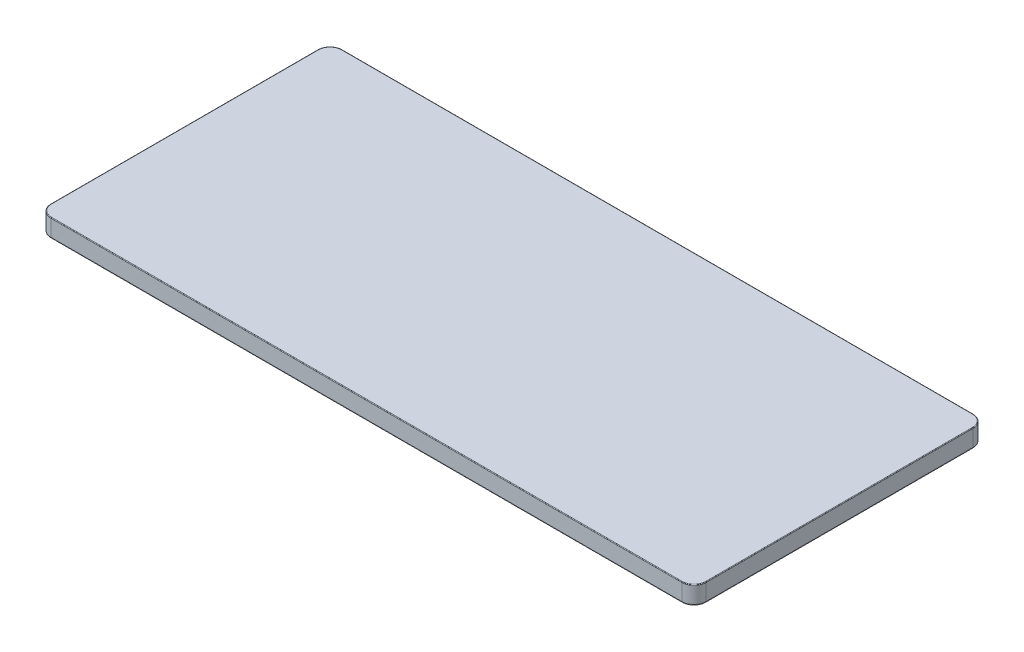
ISO-10303-21;
HEADER;
FILE_DESCRIPTION(('STEP AP214'),'2;1');
FILE_NAME('part.step','',(''),(''),'','','');
FILE_SCHEMA(('AUTOMOTIVE_DESIGN { 1 0 10303 214 1 1 1 1 }'));
ENDSEC;
DATA;
#1=APPLICATION_CONTEXT('core data for automotive mechanical design processes');
#2=APPLICATION_PROTOCOL_DEFINITION('international standard','automotive_design',2000,#1);
#3=PRODUCT_CONTEXT('',#1,'mechanical');
#4=PRODUCT('Part','Part','',(#3));
#5=PRODUCT_RELATED_PRODUCT_CATEGORY('part','',(#4));
#6=PRODUCT_DEFINITION_FORMATION('','',#4);
#7=PRODUCT_DEFINITION_CONTEXT('part definition',#1,'design');
#8=PRODUCT_DEFINITION('design','',#6,#7);
#9=PRODUCT_DEFINITION_SHAPE('','',#8);
#10=(LENGTH_UNIT() NAMED_UNIT(*) SI_UNIT(.MILLI.,.METRE.));
#11=(NAMED_UNIT(*) PLANE_ANGLE_UNIT() SI_UNIT($,.RADIAN.));
#12=(NAMED_UNIT(*) SI_UNIT($,.STERADIAN.) SOLID_ANGLE_UNIT());
#13=UNCERTAINTY_MEASURE_WITH_UNIT(LENGTH_MEASURE(1.E-05),#10,'distance_accuracy_value','');
#14=(GEOMETRIC_REPRESENTATION_CONTEXT(3) GLOBAL_UNCERTAINTY_ASSIGNED_CONTEXT((#13)) GLOBAL_UNIT_ASSIGNED_CONTEXT((#10,
#11,#12)) REPRESENTATION_CONTEXT('',''));
#15=CARTESIAN_POINT('',(0.,0.,0.));
#16=DIRECTION('',(0.,0.,1.));
#17=DIRECTION('',(1.,0.,0.));
#18=AXIS2_PLACEMENT_3D('',#15,#16,#17);
#19=CARTESIAN_POINT('',(660.4,-38.1,279.4));
#20=DIRECTION('',(0.,1.,0.));
#21=DIRECTION('',(0.,0.,1.));
#22=AXIS2_PLACEMENT_3D('',#19,#20,#21);
#23=PLANE('',#22);
#24=CARTESIAN_POINT('',(-342.9,-38.1,127.));
#25=DIRECTION('',(0.,-1.,0.));
#26=DIRECTION('',(0.,0.,-1.));
#27=AXIS2_PLACEMENT_3D('',#24,#25,#26);
#28=CIRCLE('',#27,1.58750000000004);
#29=CARTESIAN_POINT('',(-342.9,-38.1,125.4125));
#30=VERTEX_POINT('',#29);
#31=EDGE_CURVE('E322',#30,#30,#28,.T.);
#32=ORIENTED_EDGE('',*,*,#31,.F.);
#33=EDGE_LOOP('',(#32));
#34=FACE_BOUND('',#33,.T.);
#35=CARTESIAN_POINT('',(457.2,-38.1,-127.));
#36=DIRECTION('',(0.,-1.,0.));
#37=DIRECTION('',(0.,0.,-1.));
#38=AXIS2_PLACEMENT_3D('',#35,#36,#37);
#39=CIRCLE('',#38,1.58750000000004);
#40=CARTESIAN_POINT('',(457.2,-38.1,-128.5875));
#41=VERTEX_POINT('',#40);
#42=EDGE_CURVE('E353',#41,#41,#39,.T.);
#43=ORIENTED_EDGE('',*,*,#42,.F.);
#44=EDGE_LOOP('',(#43));
#45=FACE_BOUND('',#44,.T.);
#46=CARTESIAN_POINT('',(342.9,-38.1,-127.));
#47=DIRECTION('',(0.,-1.,0.));
#48=DIRECTION('',(0.,0.,-1.));
#49=AXIS2_PLACEMENT_3D('',#46,#47,#48);
#50=CIRCLE('',#49,1.58750000000004);
#51=CARTESIAN_POINT('',(342.9,-38.1,-128.5875));
#52=VERTEX_POINT('',#51);
#53=EDGE_CURVE('E352',#52,#52,#50,.T.);
#54=ORIENTED_EDGE('',*,*,#53,.F.);
#55=EDGE_LOOP('',(#54));
#56=FACE_BOUND('',#55,.T.);
#57=CARTESIAN_POINT('',(-457.2,-38.1,127.));
#58=DIRECTION('',(0.,-1.,0.));
#59=DIRECTION('',(0.,0.,-1.));
#60=AXIS2_PLACEMENT_3D('',#57,#58,#59);
#61=CIRCLE('',#60,1.58750000000004);
#62=CARTESIAN_POINT('',(-457.2,-38.1,125.4125));
#63=VERTEX_POINT('',#62);
#64=EDGE_CURVE('E319',#63,#63,#61,.T.);
#65=ORIENTED_EDGE('',*,*,#64,.F.);
#66=EDGE_LOOP('',(#65));
#67=FACE_BOUND('',#66,.T.);
#68=DIRECTION('',(1.,0.,0.));
#69=VECTOR('',#68,1.);
#70=CARTESIAN_POINT('',(-660.4,-38.1,302.26));
#71=LINE('',#70,#69);
#72=CARTESIAN_POINT('',(660.4,-38.1,302.26));
#73=VERTEX_POINT('',#72);
#74=CARTESIAN_POINT('',(-660.4,-38.1,302.26));
#75=VERTEX_POINT('',#74);
#76=EDGE_CURVE('E194',#73,#75,#71,.F.);
#77=ORIENTED_EDGE('',*,*,#76,.T.);
#78=CARTESIAN_POINT('',(-660.4,-38.1,279.4));
#79=DIRECTION('',(0.,1.,0.));
#80=DIRECTION('',(0.,0.,1.));
#81=AXIS2_PLACEMENT_3D('',#78,#79,#80);
#82=CIRCLE('',#81,22.86);
#83=CARTESIAN_POINT('',(-683.26,-38.1,279.4));
#84=VERTEX_POINT('',#83);
#85=EDGE_CURVE('E167',#75,#84,#82,.F.);
#86=ORIENTED_EDGE('',*,*,#85,.T.);
#87=DIRECTION('',(0.,0.,1.));
#88=VECTOR('',#87,1.);
#89=CARTESIAN_POINT('',(-683.26,-38.1,-279.4));
#90=LINE('',#89,#88);
#91=CARTESIAN_POINT('',(-683.26,-38.1,-279.4));
#92=VERTEX_POINT('',#91);
#93=EDGE_CURVE('E184',#84,#92,#90,.F.);
#94=ORIENTED_EDGE('',*,*,#93,.T.);
#95=CARTESIAN_POINT('',(-660.4,-38.1,-279.4));
#96=DIRECTION('',(0.,1.,0.));
#97=DIRECTION('',(0.,0.,1.));
#98=AXIS2_PLACEMENT_3D('',#95,#96,#97);
#99=CIRCLE('',#98,22.86);
#100=CARTESIAN_POINT('',(-660.4,-38.1,-302.26));
#101=VERTEX_POINT('',#100);
#102=EDGE_CURVE('E211',#92,#101,#99,.F.);
#103=ORIENTED_EDGE('',*,*,#102,.T.);
#104=DIRECTION('',(-1.,0.,0.));
#105=VECTOR('',#104,1.);
#106=CARTESIAN_POINT('',(660.4,-38.1,-302.26));
#107=LINE('',#106,#105);
#108=CARTESIAN_POINT('',(660.4,-38.1,-302.26));
#109=VERTEX_POINT('',#108);
#110=EDGE_CURVE('E209',#101,#109,#107,.F.);
#111=ORIENTED_EDGE('',*,*,#110,.T.);
#112=CARTESIAN_POINT('',(660.4,-38.1,-279.4));
#113=DIRECTION('',(0.,1.,0.));
#114=DIRECTION('',(0.,0.,1.));
#115=AXIS2_PLACEMENT_3D('',#112,#113,#114);
#116=CIRCLE('',#115,22.8599999999999);
#117=CARTESIAN_POINT('',(683.26,-38.1,-279.4));
#118=VERTEX_POINT('',#117);
#119=EDGE_CURVE('E207',#109,#118,#116,.F.);
#120=ORIENTED_EDGE('',*,*,#119,.T.);
#121=DIRECTION('',(0.,0.,-1.));
#122=VECTOR('',#121,1.);
#123=CARTESIAN_POINT('',(683.26,-38.1,279.4));
#124=LINE('',#123,#122);
#125=CARTESIAN_POINT('',(683.26,-38.1,279.4));
#126=VERTEX_POINT('',#125);
#127=EDGE_CURVE('E205',#118,#126,#124,.F.);
#128=ORIENTED_EDGE('',*,*,#127,.T.);
#129=CARTESIAN_POINT('',(660.4,-38.1,279.4));
#130=DIRECTION('',(0.,1.,0.));
#131=DIRECTION('',(0.,0.,1.));
#132=AXIS2_PLACEMENT_3D('',#129,#130,#131);
#133=CIRCLE('',#132,22.8599999999999);
#134=EDGE_CURVE('E197',#126,#73,#133,.F.);
#135=ORIENTED_EDGE('',*,*,#134,.T.);
#136=EDGE_LOOP('',(#77,#86,#94,#103,#111,#120,#128,#135));
#137=FACE_BOUND('',#136,.T.);
#138=CARTESIAN_POINT('',(457.2,-38.1,127.));
#139=DIRECTION('',(0.,1.,0.));
#140=DIRECTION('',(0.,0.,1.));
#141=AXIS2_PLACEMENT_3D('',#138,#139,#140);
#142=CIRCLE('',#141,1.58750000000004);
#143=CARTESIAN_POINT('',(457.2,-38.1,128.5875));
#144=VERTEX_POINT('',#143);
#145=EDGE_CURVE('E341',#144,#144,#142,.T.);
#146=ORIENTED_EDGE('',*,*,#145,.T.);
#147=EDGE_LOOP('',(#146));
#148=FACE_BOUND('',#147,.T.);
#149=CARTESIAN_POINT('',(-457.2,-38.1,-127.));
#150=DIRECTION('',(0.,1.,0.));
#151=DIRECTION('',(0.,0.,1.));
#152=AXIS2_PLACEMENT_3D('',#149,#150,#151);
#153=CIRCLE('',#152,1.58750000000004);
#154=CARTESIAN_POINT('',(-457.2,-38.1,-125.4125));
#155=VERTEX_POINT('',#154);
#156=EDGE_CURVE('E328',#155,#155,#153,.T.);
#157=ORIENTED_EDGE('',*,*,#156,.T.);
#158=EDGE_LOOP('',(#157));
#159=FACE_BOUND('',#158,.T.);
#160=CARTESIAN_POINT('',(-342.9,-38.1,-127.));
#161=DIRECTION('',(0.,1.,0.));
#162=DIRECTION('',(0.,0.,1.));
#163=AXIS2_PLACEMENT_3D('',#160,#161,#162);
#164=CIRCLE('',#163,1.58750000000004);
#165=CARTESIAN_POINT('',(-342.9,-38.1,-125.4125));
#166=VERTEX_POINT('',#165);
#167=EDGE_CURVE('E329',#166,#166,#164,.T.);
#168=ORIENTED_EDGE('',*,*,#167,.T.);
#169=EDGE_LOOP('',(#168));
#170=FACE_BOUND('',#169,.T.);
#171=CARTESIAN_POINT('',(342.9,-38.1,127.));
#172=DIRECTION('',(0.,1.,0.));
#173=DIRECTION('',(0.,0.,1.));
#174=AXIS2_PLACEMENT_3D('',#171,#172,#173);
#175=CIRCLE('',#174,1.58750000000004);
#176=CARTESIAN_POINT('',(342.9,-38.1,128.5875));
#177=VERTEX_POINT('',#176);
#178=EDGE_CURVE('E340',#177,#177,#175,.T.);
#179=ORIENTED_EDGE('',*,*,#178,.T.);
#180=EDGE_LOOP('',(#179));
#181=FACE_BOUND('',#180,.T.);
#182=ADVANCED_FACE('F39',(#34,#45,#56,#67,#137,#148,#159,#170,#181),#23,.F.);
#183=CARTESIAN_POINT('',(660.4,-38.1,279.4));
#184=DIRECTION('',(0.,1.,0.));
#185=DIRECTION('',(0.,0.,1.));
#186=AXIS2_PLACEMENT_3D('',#183,#184,#185);
#187=CYLINDRICAL_SURFACE('',#186,25.3999999999999);
#188=DIRECTION('',(0.,1.,0.));
#189=VECTOR('',#188,1.);
#190=CARTESIAN_POINT('',(685.8,-38.1,279.4));
#191=LINE('',#190,#189);
#192=CARTESIAN_POINT('',(685.8,-35.56,279.4));
#193=VERTEX_POINT('',#192);
#194=CARTESIAN_POINT('',(685.8,-1.27000000000001,279.4));
#195=VERTEX_POINT('',#194);
#196=EDGE_CURVE('E201',#193,#195,#191,.T.);
#197=ORIENTED_EDGE('',*,*,#196,.T.);
#198=CARTESIAN_POINT('',(660.4,-1.27,279.4));
#199=DIRECTION('',(0.,1.,0.));
#200=DIRECTION('',(0.,0.,1.));
#201=AXIS2_PLACEMENT_3D('',#198,#199,#200);
#202=CIRCLE('',#201,25.3999999999999);
#203=CARTESIAN_POINT('',(660.4,-1.27000000000001,304.8));
#204=VERTEX_POINT('',#203);
#205=EDGE_CURVE('E48',#195,#204,#202,.F.);
#206=ORIENTED_EDGE('',*,*,#205,.T.);
#207=DIRECTION('',(0.,1.,0.));
#208=VECTOR('',#207,1.);
#209=CARTESIAN_POINT('',(660.4,-38.1,304.8));
#210=LINE('',#209,#208);
#211=CARTESIAN_POINT('',(660.4,-35.56,304.8));
#212=VERTEX_POINT('',#211);
#213=EDGE_CURVE('E195',#212,#204,#210,.T.);
#214=ORIENTED_EDGE('',*,*,#213,.F.);
#215=CARTESIAN_POINT('',(660.4,-35.56,279.4));
#216=DIRECTION('',(0.,1.,0.));
#217=DIRECTION('',(0.,0.,1.));
#218=AXIS2_PLACEMENT_3D('',#215,#216,#217);
#219=CIRCLE('',#218,25.3999999999999);
#220=EDGE_CURVE('E222',#212,#193,#219,.T.);
#221=ORIENTED_EDGE('',*,*,#220,.T.);
#222=EDGE_LOOP('',(#197,#206,#214,#221));
#223=FACE_BOUND('',#222,.T.);
#224=ADVANCED_FACE('F371',(#223),#187,.T.);
#225=CARTESIAN_POINT('',(-660.4,-38.1,304.8));
#226=DIRECTION('',(0.,0.,1.));
#227=DIRECTION('',(1.,0.,0.));
#228=AXIS2_PLACEMENT_3D('',#225,#226,#227);
#229=PLANE('',#228);
#230=ORIENTED_EDGE('',*,*,#213,.T.);
#231=DIRECTION('',(1.,0.,0.));
#232=VECTOR('',#231,1.);
#233=CARTESIAN_POINT('',(-660.4,-1.27,304.8));
#234=LINE('',#233,#232);
#235=CARTESIAN_POINT('',(-660.4,-1.27000000000001,304.8));
#236=VERTEX_POINT('',#235);
#237=EDGE_CURVE('E11',#204,#236,#234,.F.);
#238=ORIENTED_EDGE('',*,*,#237,.T.);
#239=DIRECTION('',(0.,1.,0.));
#240=VECTOR('',#239,1.);
#241=CARTESIAN_POINT('',(-660.4,-38.1,304.8));
#242=LINE('',#241,#240);
#243=CARTESIAN_POINT('',(-660.4,-35.56,304.8));
#244=VERTEX_POINT('',#243);
#245=EDGE_CURVE('E179',#244,#236,#242,.T.);
#246=ORIENTED_EDGE('',*,*,#245,.F.);
#247=DIRECTION('',(1.,0.,0.));
#248=VECTOR('',#247,1.);
#249=CARTESIAN_POINT('',(660.4,-35.56,304.8));
#250=LINE('',#249,#248);
#251=EDGE_CURVE('E224',#244,#212,#250,.T.);
#252=ORIENTED_EDGE('',*,*,#251,.T.);
#253=EDGE_LOOP('',(#230,#238,#246,#252));
#254=FACE_BOUND('',#253,.T.);
#255=ADVANCED_FACE('F437',(#254),#229,.T.);
#256=CARTESIAN_POINT('',(-660.4,-38.1,279.4));
#257=DIRECTION('',(0.,1.,0.));
#258=DIRECTION('',(0.,0.,1.));
#259=AXIS2_PLACEMENT_3D('',#256,#257,#258);
#260=CYLINDRICAL_SURFACE('',#259,25.4);
#261=ORIENTED_EDGE('',*,*,#245,.T.);
#262=CARTESIAN_POINT('',(-660.4,-1.27,279.4));
#263=DIRECTION('',(0.,1.,0.));
#264=DIRECTION('',(0.,0.,1.));
#265=AXIS2_PLACEMENT_3D('',#262,#263,#264);
#266=CIRCLE('',#265,25.4);
#267=CARTESIAN_POINT('',(-685.8,-1.27000000000001,279.4));
#268=VERTEX_POINT('',#267);
#269=EDGE_CURVE('E178',#236,#268,#266,.F.);
#270=ORIENTED_EDGE('',*,*,#269,.T.);
#271=DIRECTION('',(0.,1.,0.));
#272=VECTOR('',#271,1.);
#273=CARTESIAN_POINT('',(-685.8,-38.1,279.4));
#274=LINE('',#273,#272);
#275=CARTESIAN_POINT('',(-685.8,-35.56,279.4));
#276=VERTEX_POINT('',#275);
#277=EDGE_CURVE('E159',#276,#268,#274,.T.);
#278=ORIENTED_EDGE('',*,*,#277,.F.);
#279=CARTESIAN_POINT('',(-660.4,-35.56,279.4));
#280=DIRECTION('',(0.,1.,0.));
#281=DIRECTION('',(0.,0.,1.));
#282=AXIS2_PLACEMENT_3D('',#279,#280,#281);
#283=CIRCLE('',#282,25.4);
#284=EDGE_CURVE('E175',#276,#244,#283,.T.);
#285=ORIENTED_EDGE('',*,*,#284,.T.);
#286=EDGE_LOOP('',(#261,#270,#278,#285));
#287=FACE_BOUND('',#286,.T.);
#288=ADVANCED_FACE('F173',(#287),#260,.T.);
#289=CARTESIAN_POINT('',(-685.8,-38.1,279.4));
#290=DIRECTION('',(-1.,0.,0.));
#291=DIRECTION('',(0.,0.,1.));
#292=AXIS2_PLACEMENT_3D('',#289,#290,#291);
#293=PLANE('',#292);
#294=ORIENTED_EDGE('',*,*,#277,.T.);
#295=DIRECTION('',(0.,0.,1.));
#296=VECTOR('',#295,1.);
#297=CARTESIAN_POINT('',(-685.8,-1.27,279.4));
#298=LINE('',#297,#296);
#299=CARTESIAN_POINT('',(-685.8,-1.27000000000001,-279.4));
#300=VERTEX_POINT('',#299);
#301=EDGE_CURVE('E261',#268,#300,#298,.F.);
#302=ORIENTED_EDGE('',*,*,#301,.T.);
#303=DIRECTION('',(0.,1.,0.));
#304=VECTOR('',#303,1.);
#305=CARTESIAN_POINT('',(-685.8,-38.1,-279.4));
#306=LINE('',#305,#304);
#307=CARTESIAN_POINT('',(-685.8,-35.56,-279.4));
#308=VERTEX_POINT('',#307);
#309=EDGE_CURVE('E161',#308,#300,#306,.T.);
#310=ORIENTED_EDGE('',*,*,#309,.F.);
#311=DIRECTION('',(0.,0.,1.));
#312=VECTOR('',#311,1.);
#313=CARTESIAN_POINT('',(-685.8,-35.56,279.4));
#314=LINE('',#313,#312);
#315=EDGE_CURVE('E156',#308,#276,#314,.T.);
#316=ORIENTED_EDGE('',*,*,#315,.T.);
#317=EDGE_LOOP('',(#294,#302,#310,#316));
#318=FACE_BOUND('',#317,.T.);
#319=ADVANCED_FACE('F158',(#318),#293,.T.);
#320=CARTESIAN_POINT('',(-660.4,-38.1,-279.4));
#321=DIRECTION('',(0.,1.,0.));
#322=DIRECTION('',(0.,0.,1.));
#323=AXIS2_PLACEMENT_3D('',#320,#321,#322);
#324=CYLINDRICAL_SURFACE('',#323,25.4);
#325=ORIENTED_EDGE('',*,*,#309,.T.);
#326=CARTESIAN_POINT('',(-660.4,-1.27,-279.4));
#327=DIRECTION('',(0.,1.,0.));
#328=DIRECTION('',(0.,0.,1.));
#329=AXIS2_PLACEMENT_3D('',#326,#327,#328);
#330=CIRCLE('',#329,25.4);
#331=CARTESIAN_POINT('',(-660.4,-1.27000000000001,-304.8));
#332=VERTEX_POINT('',#331);
#333=EDGE_CURVE('E263',#300,#332,#330,.F.);
#334=ORIENTED_EDGE('',*,*,#333,.T.);
#335=DIRECTION('',(0.,1.,0.));
#336=VECTOR('',#335,1.);
#337=CARTESIAN_POINT('',(-660.4,-38.1,-304.8));
#338=LINE('',#337,#336);
#339=CARTESIAN_POINT('',(-660.4,-35.56,-304.8));
#340=VERTEX_POINT('',#339);
#341=EDGE_CURVE('E312',#340,#332,#338,.T.);
#342=ORIENTED_EDGE('',*,*,#341,.F.);
#343=CARTESIAN_POINT('',(-660.4,-35.56,-279.4));
#344=DIRECTION('',(0.,1.,0.));
#345=DIRECTION('',(0.,0.,1.));
#346=AXIS2_PLACEMENT_3D('',#343,#344,#345);
#347=CIRCLE('',#346,25.4);
#348=EDGE_CURVE('E166',#340,#308,#347,.T.);
#349=ORIENTED_EDGE('',*,*,#348,.T.);
#350=EDGE_LOOP('',(#325,#334,#342,#349));
#351=FACE_BOUND('',#350,.T.);
#352=ADVANCED_FACE('F445',(#351),#324,.T.);
#353=CARTESIAN_POINT('',(-660.4,-38.1,-304.8));
#354=DIRECTION('',(0.,0.,-1.));
#355=DIRECTION('',(-1.,0.,0.));
#356=AXIS2_PLACEMENT_3D('',#353,#354,#355);
#357=PLANE('',#356);
#358=ORIENTED_EDGE('',*,*,#341,.T.);
#359=DIRECTION('',(-1.,0.,0.));
#360=VECTOR('',#359,1.);
#361=CARTESIAN_POINT('',(-660.4,-1.27,-304.8));
#362=LINE('',#361,#360);
#363=CARTESIAN_POINT('',(660.4,-1.27000000000001,-304.8));
#364=VERTEX_POINT('',#363);
#365=EDGE_CURVE('E265',#332,#364,#362,.F.);
#366=ORIENTED_EDGE('',*,*,#365,.T.);
#367=DIRECTION('',(0.,1.,0.));
#368=VECTOR('',#367,1.);
#369=CARTESIAN_POINT('',(660.4,-38.1,-304.8));
#370=LINE('',#369,#368);
#371=CARTESIAN_POINT('',(660.4,-35.56,-304.8));
#372=VERTEX_POINT('',#371);
#373=EDGE_CURVE('E309',#372,#364,#370,.T.);
#374=ORIENTED_EDGE('',*,*,#373,.F.);
#375=DIRECTION('',(-1.,0.,0.));
#376=VECTOR('',#375,1.);
#377=CARTESIAN_POINT('',(-660.4,-35.56,-304.8));
#378=LINE('',#377,#376);
#379=EDGE_CURVE('E216',#372,#340,#378,.T.);
#380=ORIENTED_EDGE('',*,*,#379,.T.);
#381=EDGE_LOOP('',(#358,#366,#374,#380));
#382=FACE_BOUND('',#381,.T.);
#383=ADVANCED_FACE('F448',(#382),#357,.T.);
#384=CARTESIAN_POINT('',(660.4,-38.1,-279.4));
#385=DIRECTION('',(0.,1.,0.));
#386=DIRECTION('',(0.,0.,1.));
#387=AXIS2_PLACEMENT_3D('',#384,#385,#386);
#388=CYLINDRICAL_SURFACE('',#387,25.3999999999999);
#389=ORIENTED_EDGE('',*,*,#373,.T.);
#390=CARTESIAN_POINT('',(660.4,-1.27,-279.4));
#391=DIRECTION('',(0.,1.,0.));
#392=DIRECTION('',(0.,0.,1.));
#393=AXIS2_PLACEMENT_3D('',#390,#391,#392);
#394=CIRCLE('',#393,25.3999999999999);
#395=CARTESIAN_POINT('',(685.8,-1.27000000000001,-279.4));
#396=VERTEX_POINT('',#395);
#397=EDGE_CURVE('E267',#364,#396,#394,.F.);
#398=ORIENTED_EDGE('',*,*,#397,.T.);
#399=DIRECTION('',(0.,1.,0.));
#400=VECTOR('',#399,1.);
#401=CARTESIAN_POINT('',(685.8,-38.1,-279.4));
#402=LINE('',#401,#400);
#403=CARTESIAN_POINT('',(685.8,-35.56,-279.4));
#404=VERTEX_POINT('',#403);
#405=EDGE_CURVE('E306',#404,#396,#402,.T.);
#406=ORIENTED_EDGE('',*,*,#405,.F.);
#407=CARTESIAN_POINT('',(660.4,-35.56,-279.4));
#408=DIRECTION('',(0.,1.,0.));
#409=DIRECTION('',(0.,0.,1.));
#410=AXIS2_PLACEMENT_3D('',#407,#408,#409);
#411=CIRCLE('',#410,25.3999999999999);
#412=EDGE_CURVE('E218',#404,#372,#411,.T.);
#413=ORIENTED_EDGE('',*,*,#412,.T.);
#414=EDGE_LOOP('',(#389,#398,#406,#413));
#415=FACE_BOUND('',#414,.T.);
#416=ADVANCED_FACE('F305',(#415),#388,.T.);
#417=CARTESIAN_POINT('',(685.8,-38.1,279.4));
#418=DIRECTION('',(1.,0.,0.));
#419=DIRECTION('',(0.,0.,-1.));
#420=AXIS2_PLACEMENT_3D('',#417,#418,#419);
#421=PLANE('',#420);
#422=ORIENTED_EDGE('',*,*,#405,.T.);
#423=DIRECTION('',(0.,0.,-1.));
#424=VECTOR('',#423,1.);
#425=CARTESIAN_POINT('',(685.8,-1.27,279.4));
#426=LINE('',#425,#424);
#427=EDGE_CURVE('E63',#396,#195,#426,.F.);
#428=ORIENTED_EDGE('',*,*,#427,.T.);
#429=ORIENTED_EDGE('',*,*,#196,.F.);
#430=DIRECTION('',(0.,0.,-1.));
#431=VECTOR('',#430,1.);
#432=CARTESIAN_POINT('',(685.8,-35.56,-279.4));
#433=LINE('',#432,#431);
#434=EDGE_CURVE('E220',#193,#404,#433,.T.);
#435=ORIENTED_EDGE('',*,*,#434,.T.);
#436=EDGE_LOOP('',(#422,#428,#429,#435));
#437=FACE_BOUND('',#436,.T.);
#438=ADVANCED_FACE('F310',(#437),#421,.T.);
#439=CARTESIAN_POINT('',(660.4,0.,279.4));
#440=DIRECTION('',(0.,1.,0.));
#441=DIRECTION('',(0.,0.,1.));
#442=AXIS2_PLACEMENT_3D('',#439,#440,#441);
#443=PLANE('',#442);
#444=DIRECTION('',(0.,0.,1.));
#445=VECTOR('',#444,1.);
#446=CARTESIAN_POINT('',(-684.53,0.,279.4));
#447=LINE('',#446,#445);
#448=CARTESIAN_POINT('',(-684.53,0.,-279.4));
#449=VERTEX_POINT('',#448);
#450=CARTESIAN_POINT('',(-684.53,0.,279.4));
#451=VERTEX_POINT('',#450);
#452=EDGE_CURVE('E255',#449,#451,#447,.T.);
#453=ORIENTED_EDGE('',*,*,#452,.T.);
#454=CARTESIAN_POINT('',(-660.4,0.,279.4));
#455=DIRECTION('',(0.,1.,0.));
#456=DIRECTION('',(0.,0.,1.));
#457=AXIS2_PLACEMENT_3D('',#454,#455,#456);
#458=CIRCLE('',#457,24.13);
#459=CARTESIAN_POINT('',(-660.4,0.,303.53));
#460=VERTEX_POINT('',#459);
#461=EDGE_CURVE('E257',#451,#460,#458,.T.);
#462=ORIENTED_EDGE('',*,*,#461,.T.);
#463=DIRECTION('',(1.,0.,0.));
#464=VECTOR('',#463,1.);
#465=CARTESIAN_POINT('',(660.4,0.,303.53));
#466=LINE('',#465,#464);
#467=CARTESIAN_POINT('',(660.4,0.,303.53));
#468=VERTEX_POINT('',#467);
#469=EDGE_CURVE('E226',#460,#468,#466,.T.);
#470=ORIENTED_EDGE('',*,*,#469,.T.);
#471=CARTESIAN_POINT('',(660.4,0.,279.4));
#472=DIRECTION('',(0.,1.,0.));
#473=DIRECTION('',(0.,0.,1.));
#474=AXIS2_PLACEMENT_3D('',#471,#472,#473);
#475=CIRCLE('',#474,24.1299999999999);
#476=CARTESIAN_POINT('',(684.53,0.,279.4));
#477=VERTEX_POINT('',#476);
#478=EDGE_CURVE('E245',#468,#477,#475,.T.);
#479=ORIENTED_EDGE('',*,*,#478,.T.);
#480=DIRECTION('',(0.,0.,-1.));
#481=VECTOR('',#480,1.);
#482=CARTESIAN_POINT('',(684.53,0.,279.4));
#483=LINE('',#482,#481);
#484=CARTESIAN_POINT('',(684.53,0.,-279.4));
#485=VERTEX_POINT('',#484);
#486=EDGE_CURVE('E247',#477,#485,#483,.T.);
#487=ORIENTED_EDGE('',*,*,#486,.T.);
#488=CARTESIAN_POINT('',(660.4,0.,-279.4));
#489=DIRECTION('',(0.,1.,0.));
#490=DIRECTION('',(0.,0.,1.));
#491=AXIS2_PLACEMENT_3D('',#488,#489,#490);
#492=CIRCLE('',#491,24.1299999999999);
#493=CARTESIAN_POINT('',(660.4,0.,-303.53));
#494=VERTEX_POINT('',#493);
#495=EDGE_CURVE('E249',#485,#494,#492,.T.);
#496=ORIENTED_EDGE('',*,*,#495,.T.);
#497=DIRECTION('',(-1.,0.,0.));
#498=VECTOR('',#497,1.);
#499=CARTESIAN_POINT('',(660.4,0.,-303.53));
#500=LINE('',#499,#498);
#501=CARTESIAN_POINT('',(-660.4,0.,-303.53));
#502=VERTEX_POINT('',#501);
#503=EDGE_CURVE('E251',#494,#502,#500,.T.);
#504=ORIENTED_EDGE('',*,*,#503,.T.);
#505=CARTESIAN_POINT('',(-660.4,0.,-279.4));
#506=DIRECTION('',(0.,1.,0.));
#507=DIRECTION('',(0.,0.,1.));
#508=AXIS2_PLACEMENT_3D('',#505,#506,#507);
#509=CIRCLE('',#508,24.13);
#510=EDGE_CURVE('E253',#502,#449,#509,.T.);
#511=ORIENTED_EDGE('',*,*,#510,.T.);
#512=EDGE_LOOP('',(#453,#462,#470,#479,#487,#496,#504,#511));
#513=FACE_BOUND('',#512,.T.);
#514=ADVANCED_FACE('F432',(#513),#443,.T.);
#515=CARTESIAN_POINT('',(660.4,-35.56,-279.4));
#516=DIRECTION('',(0.,1.,0.));
#517=DIRECTION('',(0.,0.,1.));
#518=AXIS2_PLACEMENT_3D('',#515,#516,#517);
#519=TOROIDAL_SURFACE('',#518,22.8599999999999,2.54);
#520=CARTESIAN_POINT('',(683.26,-35.56,-279.4));
#521=DIRECTION('',(0.,0.,1.));
#522=DIRECTION('',(1.,0.,0.));
#523=AXIS2_PLACEMENT_3D('',#520,#521,#522);
#524=CIRCLE('',#523,2.54);
#525=EDGE_CURVE('E238',#118,#404,#524,.T.);
#526=ORIENTED_EDGE('',*,*,#525,.F.);
#527=ORIENTED_EDGE('',*,*,#119,.F.);
#528=CARTESIAN_POINT('',(660.4,-35.56,-302.26));
#529=DIRECTION('',(-1.,0.,0.));
#530=DIRECTION('',(0.,0.,1.));
#531=AXIS2_PLACEMENT_3D('',#528,#529,#530);
#532=CIRCLE('',#531,2.54);
#533=EDGE_CURVE('E241',#372,#109,#532,.T.);
#534=ORIENTED_EDGE('',*,*,#533,.F.);
#535=ORIENTED_EDGE('',*,*,#412,.F.);
#536=EDGE_LOOP('',(#526,#527,#534,#535));
#537=FACE_BOUND('',#536,.T.);
#538=ADVANCED_FACE('F435',(#537),#519,.T.);
#539=CARTESIAN_POINT('',(-660.4,-35.56,-302.26));
#540=DIRECTION('',(1.,0.,0.));
#541=DIRECTION('',(0.,0.,-1.));
#542=AXIS2_PLACEMENT_3D('',#539,#540,#541);
#543=CYLINDRICAL_SURFACE('',#542,2.54);
#544=ORIENTED_EDGE('',*,*,#533,.T.);
#545=ORIENTED_EDGE('',*,*,#110,.F.);
#546=CARTESIAN_POINT('',(-660.4,-35.56,-302.26));
#547=DIRECTION('',(-1.,0.,0.));
#548=DIRECTION('',(0.,0.,1.));
#549=AXIS2_PLACEMENT_3D('',#546,#547,#548);
#550=CIRCLE('',#549,2.54);
#551=EDGE_CURVE('E235',#340,#101,#550,.T.);
#552=ORIENTED_EDGE('',*,*,#551,.F.);
#553=ORIENTED_EDGE('',*,*,#379,.F.);
#554=EDGE_LOOP('',(#544,#545,#552,#553));
#555=FACE_BOUND('',#554,.T.);
#556=ADVANCED_FACE('F478',(#555),#543,.T.);
#557=CARTESIAN_POINT('',(683.26,-35.56,279.4));
#558=DIRECTION('',(0.,0.,1.));
#559=DIRECTION('',(1.,0.,0.));
#560=AXIS2_PLACEMENT_3D('',#557,#558,#559);
#561=CYLINDRICAL_SURFACE('',#560,2.54);
#562=ORIENTED_EDGE('',*,*,#525,.T.);
#563=ORIENTED_EDGE('',*,*,#434,.F.);
#564=CARTESIAN_POINT('',(683.26,-35.56,279.4));
#565=DIRECTION('',(0.,0.,1.));
#566=DIRECTION('',(1.,0.,0.));
#567=AXIS2_PLACEMENT_3D('',#564,#565,#566);
#568=CIRCLE('',#567,2.54);
#569=EDGE_CURVE('E232',#126,#193,#568,.T.);
#570=ORIENTED_EDGE('',*,*,#569,.F.);
#571=ORIENTED_EDGE('',*,*,#127,.F.);
#572=EDGE_LOOP('',(#562,#563,#570,#571));
#573=FACE_BOUND('',#572,.T.);
#574=ADVANCED_FACE('F474',(#573),#561,.T.);
#575=CARTESIAN_POINT('',(-660.4,-35.56,-279.4));
#576=DIRECTION('',(0.,1.,0.));
#577=DIRECTION('',(0.,0.,1.));
#578=AXIS2_PLACEMENT_3D('',#575,#576,#577);
#579=TOROIDAL_SURFACE('',#578,22.86,2.54);
#580=ORIENTED_EDGE('',*,*,#551,.T.);
#581=ORIENTED_EDGE('',*,*,#102,.F.);
#582=CARTESIAN_POINT('',(-683.26,-35.56,-279.4));
#583=DIRECTION('',(0.,0.,1.));
#584=DIRECTION('',(1.,0.,0.));
#585=AXIS2_PLACEMENT_3D('',#582,#583,#584);
#586=CIRCLE('',#585,2.54);
#587=EDGE_CURVE('E230',#308,#92,#586,.T.);
#588=ORIENTED_EDGE('',*,*,#587,.F.);
#589=ORIENTED_EDGE('',*,*,#348,.F.);
#590=EDGE_LOOP('',(#580,#581,#588,#589));
#591=FACE_BOUND('',#590,.T.);
#592=ADVANCED_FACE('F470',(#591),#579,.T.);
#593=CARTESIAN_POINT('',(660.4,-35.56,279.4));
#594=DIRECTION('',(0.,1.,0.));
#595=DIRECTION('',(0.,0.,1.));
#596=AXIS2_PLACEMENT_3D('',#593,#594,#595);
#597=TOROIDAL_SURFACE('',#596,22.8599999999999,2.54);
#598=ORIENTED_EDGE('',*,*,#569,.T.);
#599=ORIENTED_EDGE('',*,*,#220,.F.);
#600=CARTESIAN_POINT('',(660.4,-35.56,302.26));
#601=DIRECTION('',(-1.,0.,0.));
#602=DIRECTION('',(0.,0.,1.));
#603=AXIS2_PLACEMENT_3D('',#600,#601,#602);
#604=CIRCLE('',#603,2.54);
#605=EDGE_CURVE('E188',#73,#212,#604,.T.);
#606=ORIENTED_EDGE('',*,*,#605,.F.);
#607=ORIENTED_EDGE('',*,*,#134,.F.);
#608=EDGE_LOOP('',(#598,#599,#606,#607));
#609=FACE_BOUND('',#608,.T.);
#610=ADVANCED_FACE('F467',(#609),#597,.T.);
#611=CARTESIAN_POINT('',(-683.26,-35.56,279.4));
#612=DIRECTION('',(0.,0.,-1.));
#613=DIRECTION('',(-1.,0.,0.));
#614=AXIS2_PLACEMENT_3D('',#611,#612,#613);
#615=CYLINDRICAL_SURFACE('',#614,2.54);
#616=ORIENTED_EDGE('',*,*,#587,.T.);
#617=ORIENTED_EDGE('',*,*,#93,.F.);
#618=CARTESIAN_POINT('',(-683.26,-35.56,279.4));
#619=DIRECTION('',(0.,0.,1.));
#620=DIRECTION('',(1.,0.,0.));
#621=AXIS2_PLACEMENT_3D('',#618,#619,#620);
#622=CIRCLE('',#621,2.54);
#623=EDGE_CURVE('E182',#276,#84,#622,.T.);
#624=ORIENTED_EDGE('',*,*,#623,.F.);
#625=ORIENTED_EDGE('',*,*,#315,.F.);
#626=EDGE_LOOP('',(#616,#617,#624,#625));
#627=FACE_BOUND('',#626,.T.);
#628=ADVANCED_FACE('F183',(#627),#615,.T.);
#629=CARTESIAN_POINT('',(-660.4,-35.56,302.26));
#630=DIRECTION('',(-1.,0.,0.));
#631=DIRECTION('',(0.,0.,1.));
#632=AXIS2_PLACEMENT_3D('',#629,#630,#631);
#633=CYLINDRICAL_SURFACE('',#632,2.54);
#634=ORIENTED_EDGE('',*,*,#605,.T.);
#635=ORIENTED_EDGE('',*,*,#251,.F.);
#636=CARTESIAN_POINT('',(-660.4,-35.56,302.26));
#637=DIRECTION('',(-1.,0.,0.));
#638=DIRECTION('',(0.,0.,1.));
#639=AXIS2_PLACEMENT_3D('',#636,#637,#638);
#640=CIRCLE('',#639,2.54);
#641=EDGE_CURVE('E189',#75,#244,#640,.T.);
#642=ORIENTED_EDGE('',*,*,#641,.F.);
#643=ORIENTED_EDGE('',*,*,#76,.F.);
#644=EDGE_LOOP('',(#634,#635,#642,#643));
#645=FACE_BOUND('',#644,.T.);
#646=ADVANCED_FACE('F461',(#645),#633,.T.);
#647=CARTESIAN_POINT('',(-660.4,-35.56,279.4));
#648=DIRECTION('',(0.,1.,0.));
#649=DIRECTION('',(0.,0.,1.));
#650=AXIS2_PLACEMENT_3D('',#647,#648,#649);
#651=TOROIDAL_SURFACE('',#650,22.86,2.54);
#652=ORIENTED_EDGE('',*,*,#623,.T.);
#653=ORIENTED_EDGE('',*,*,#85,.F.);
#654=ORIENTED_EDGE('',*,*,#641,.T.);
#655=ORIENTED_EDGE('',*,*,#284,.F.);
#656=EDGE_LOOP('',(#652,#653,#654,#655));
#657=FACE_BOUND('',#656,.T.);
#658=ADVANCED_FACE('F191',(#657),#651,.T.);
#659=CARTESIAN_POINT('',(660.4,-1.27,-279.4));
#660=DIRECTION('',(0.,1.,0.));
#661=DIRECTION('',(0.,0.,1.));
#662=AXIS2_PLACEMENT_3D('',#659,#660,#661);
#663=TOROIDAL_SURFACE('',#662,24.1299999999999,1.27);
#664=CARTESIAN_POINT('',(684.53,-1.27,-279.4));
#665=DIRECTION('',(0.,0.,1.));
#666=DIRECTION('',(1.,0.,0.));
#667=AXIS2_PLACEMENT_3D('',#664,#665,#666);
#668=CIRCLE('',#667,1.27);
#669=EDGE_CURVE('E287',#396,#485,#668,.T.);
#670=ORIENTED_EDGE('',*,*,#669,.F.);
#671=ORIENTED_EDGE('',*,*,#397,.F.);
#672=CARTESIAN_POINT('',(660.4,-1.27,-303.53));
#673=DIRECTION('',(-1.,0.,0.));
#674=DIRECTION('',(0.,0.,1.));
#675=AXIS2_PLACEMENT_3D('',#672,#673,#674);
#676=CIRCLE('',#675,1.27);
#677=EDGE_CURVE('E43',#494,#364,#676,.T.);
#678=ORIENTED_EDGE('',*,*,#677,.F.);
#679=ORIENTED_EDGE('',*,*,#495,.F.);
#680=EDGE_LOOP('',(#670,#671,#678,#679));
#681=FACE_BOUND('',#680,.T.);
#682=ADVANCED_FACE('F41',(#681),#663,.T.);
#683=CARTESIAN_POINT('',(660.4,-1.27,-303.53));
#684=DIRECTION('',(-1.,0.,0.));
#685=DIRECTION('',(0.,0.,1.));
#686=AXIS2_PLACEMENT_3D('',#683,#684,#685);
#687=CYLINDRICAL_SURFACE('',#686,1.27);
#688=ORIENTED_EDGE('',*,*,#677,.T.);
#689=ORIENTED_EDGE('',*,*,#365,.F.);
#690=CARTESIAN_POINT('',(-660.4,-1.27,-303.53));
#691=DIRECTION('',(-1.,0.,0.));
#692=DIRECTION('',(0.,0.,1.));
#693=AXIS2_PLACEMENT_3D('',#690,#691,#692);
#694=CIRCLE('',#693,1.27);
#695=EDGE_CURVE('E285',#502,#332,#694,.T.);
#696=ORIENTED_EDGE('',*,*,#695,.F.);
#697=ORIENTED_EDGE('',*,*,#503,.F.);
#698=EDGE_LOOP('',(#688,#689,#696,#697));
#699=FACE_BOUND('',#698,.T.);
#700=ADVANCED_FACE('F297',(#699),#687,.T.);
#701=CARTESIAN_POINT('',(684.53,-1.27,279.4));
#702=DIRECTION('',(0.,0.,-1.));
#703=DIRECTION('',(-1.,0.,0.));
#704=AXIS2_PLACEMENT_3D('',#701,#702,#703);
#705=CYLINDRICAL_SURFACE('',#704,1.27);
#706=ORIENTED_EDGE('',*,*,#669,.T.);
#707=ORIENTED_EDGE('',*,*,#486,.F.);
#708=CARTESIAN_POINT('',(684.53,-1.27,279.4));
#709=DIRECTION('',(0.,0.,1.));
#710=DIRECTION('',(1.,0.,0.));
#711=AXIS2_PLACEMENT_3D('',#708,#709,#710);
#712=CIRCLE('',#711,1.27);
#713=EDGE_CURVE('E282',#195,#477,#712,.T.);
#714=ORIENTED_EDGE('',*,*,#713,.F.);
#715=ORIENTED_EDGE('',*,*,#427,.F.);
#716=EDGE_LOOP('',(#706,#707,#714,#715));
#717=FACE_BOUND('',#716,.T.);
#718=ADVANCED_FACE('F504',(#717),#705,.T.);
#719=CARTESIAN_POINT('',(-660.4,-1.27,-279.4));
#720=DIRECTION('',(0.,1.,0.));
#721=DIRECTION('',(0.,0.,1.));
#722=AXIS2_PLACEMENT_3D('',#719,#720,#721);
#723=TOROIDAL_SURFACE('',#722,24.13,1.27);
#724=ORIENTED_EDGE('',*,*,#695,.T.);
#725=ORIENTED_EDGE('',*,*,#333,.F.);
#726=CARTESIAN_POINT('',(-684.53,-1.27,-279.4));
#727=DIRECTION('',(0.,0.,1.));
#728=DIRECTION('',(1.,0.,0.));
#729=AXIS2_PLACEMENT_3D('',#726,#727,#728);
#730=CIRCLE('',#729,1.27);
#731=EDGE_CURVE('E279',#449,#300,#730,.T.);
#732=ORIENTED_EDGE('',*,*,#731,.F.);
#733=ORIENTED_EDGE('',*,*,#510,.F.);
#734=EDGE_LOOP('',(#724,#725,#732,#733));
#735=FACE_BOUND('',#734,.T.);
#736=ADVANCED_FACE('F500',(#735),#723,.T.);
#737=CARTESIAN_POINT('',(660.4,-1.27,279.4));
#738=DIRECTION('',(0.,1.,0.));
#739=DIRECTION('',(0.,0.,1.));
#740=AXIS2_PLACEMENT_3D('',#737,#738,#739);
#741=TOROIDAL_SURFACE('',#740,24.1299999999999,1.27);
#742=ORIENTED_EDGE('',*,*,#713,.T.);
#743=ORIENTED_EDGE('',*,*,#478,.F.);
#744=CARTESIAN_POINT('',(660.4,-1.27,303.53));
#745=DIRECTION('',(-1.,0.,0.));
#746=DIRECTION('',(0.,0.,1.));
#747=AXIS2_PLACEMENT_3D('',#744,#745,#746);
#748=CIRCLE('',#747,1.27);
#749=EDGE_CURVE('E276',#204,#468,#748,.T.);
#750=ORIENTED_EDGE('',*,*,#749,.F.);
#751=ORIENTED_EDGE('',*,*,#205,.F.);
#752=EDGE_LOOP('',(#742,#743,#750,#751));
#753=FACE_BOUND('',#752,.T.);
#754=ADVANCED_FACE('F496',(#753),#741,.T.);
#755=CARTESIAN_POINT('',(-684.53,-1.27,279.4));
#756=DIRECTION('',(0.,0.,1.));
#757=DIRECTION('',(1.,0.,0.));
#758=AXIS2_PLACEMENT_3D('',#755,#756,#757);
#759=CYLINDRICAL_SURFACE('',#758,1.27);
#760=ORIENTED_EDGE('',*,*,#731,.T.);
#761=ORIENTED_EDGE('',*,*,#301,.F.);
#762=CARTESIAN_POINT('',(-684.53,-1.27,279.4));
#763=DIRECTION('',(0.,0.,1.));
#764=DIRECTION('',(1.,0.,0.));
#765=AXIS2_PLACEMENT_3D('',#762,#763,#764);
#766=CIRCLE('',#765,1.27);
#767=EDGE_CURVE('E273',#451,#268,#766,.T.);
#768=ORIENTED_EDGE('',*,*,#767,.F.);
#769=ORIENTED_EDGE('',*,*,#452,.F.);
#770=EDGE_LOOP('',(#760,#761,#768,#769));
#771=FACE_BOUND('',#770,.T.);
#772=ADVANCED_FACE('F492',(#771),#759,.T.);
#773=CARTESIAN_POINT('',(660.4,-1.27,303.53));
#774=DIRECTION('',(1.,0.,0.));
#775=DIRECTION('',(0.,0.,-1.));
#776=AXIS2_PLACEMENT_3D('',#773,#774,#775);
#777=CYLINDRICAL_SURFACE('',#776,1.27);
#778=ORIENTED_EDGE('',*,*,#749,.T.);
#779=ORIENTED_EDGE('',*,*,#469,.F.);
#780=CARTESIAN_POINT('',(-660.4,-1.27,303.53));
#781=DIRECTION('',(-1.,0.,0.));
#782=DIRECTION('',(0.,0.,1.));
#783=AXIS2_PLACEMENT_3D('',#780,#781,#782);
#784=CIRCLE('',#783,1.27);
#785=EDGE_CURVE('E271',#236,#460,#784,.T.);
#786=ORIENTED_EDGE('',*,*,#785,.F.);
#787=ORIENTED_EDGE('',*,*,#237,.F.);
#788=EDGE_LOOP('',(#778,#779,#786,#787));
#789=FACE_BOUND('',#788,.T.);
#790=ADVANCED_FACE('F488',(#789),#777,.T.);
#791=CARTESIAN_POINT('',(-660.4,-1.27,279.4));
#792=DIRECTION('',(0.,1.,0.));
#793=DIRECTION('',(0.,0.,1.));
#794=AXIS2_PLACEMENT_3D('',#791,#792,#793);
#795=TOROIDAL_SURFACE('',#794,24.13,1.27);
#796=ORIENTED_EDGE('',*,*,#767,.T.);
#797=ORIENTED_EDGE('',*,*,#269,.F.);
#798=ORIENTED_EDGE('',*,*,#785,.T.);
#799=ORIENTED_EDGE('',*,*,#461,.F.);
#800=EDGE_LOOP('',(#796,#797,#798,#799));
#801=FACE_BOUND('',#800,.T.);
#802=ADVANCED_FACE('F429',(#801),#795,.T.);
#803=CARTESIAN_POINT('',(-457.2,-25.4,127.));
#804=DIRECTION('',(0.,-1.,0.));
#805=DIRECTION('',(0.,0.,-1.));
#806=AXIS2_PLACEMENT_3D('',#803,#804,#805);
#807=CYLINDRICAL_SURFACE('',#806,1.58750000000004);
#808=CARTESIAN_POINT('',(-457.2,-25.4,127.));
#809=DIRECTION('',(0.,-1.,0.));
#810=DIRECTION('',(0.,0.,-1.));
#811=AXIS2_PLACEMENT_3D('',#808,#809,#810);
#812=CIRCLE('',#811,1.58750000000004);
#813=CARTESIAN_POINT('',(-457.2,-25.4,125.4125));
#814=VERTEX_POINT('',#813);
#815=EDGE_CURVE('E274',#814,#814,#812,.T.);
#816=ORIENTED_EDGE('',*,*,#815,.F.);
#817=EDGE_LOOP('',(#816));
#818=FACE_BOUND('',#817,.T.);
#819=ORIENTED_EDGE('',*,*,#64,.T.);
#820=EDGE_LOOP('',(#819));
#821=FACE_BOUND('',#820,.T.);
#822=ADVANCED_FACE('F426',(#818,#821),#807,.F.);
#823=CARTESIAN_POINT('',(-457.2,-25.4,127.));
#824=DIRECTION('',(0.,-1.,0.));
#825=DIRECTION('',(0.,0.,-1.));
#826=AXIS2_PLACEMENT_3D('',#823,#824,#825);
#827=PLANE('',#826);
#828=ORIENTED_EDGE('',*,*,#815,.T.);
#829=EDGE_LOOP('',(#828));
#830=FACE_BOUND('',#829,.T.);
#831=ADVANCED_FACE('F422',(#830),#827,.T.);
#832=CARTESIAN_POINT('',(457.2,-25.4,127.));
#833=DIRECTION('',(0.,-1.,0.));
#834=DIRECTION('',(0.,0.,-1.));
#835=AXIS2_PLACEMENT_3D('',#832,#833,#834);
#836=CYLINDRICAL_SURFACE('',#835,1.58750000000004);
#837=CARTESIAN_POINT('',(457.2,-25.4,127.));
#838=DIRECTION('',(0.,1.,0.));
#839=DIRECTION('',(0.,0.,1.));
#840=AXIS2_PLACEMENT_3D('',#837,#838,#839);
#841=CIRCLE('',#840,1.58750000000004);
#842=CARTESIAN_POINT('',(457.2,-25.4,128.5875));
#843=VERTEX_POINT('',#842);
#844=EDGE_CURVE('E356',#843,#843,#841,.T.);
#845=ORIENTED_EDGE('',*,*,#844,.T.);
#846=EDGE_LOOP('',(#845));
#847=FACE_BOUND('',#846,.T.);
#848=ORIENTED_EDGE('',*,*,#145,.F.);
#849=EDGE_LOOP('',(#848));
#850=FACE_BOUND('',#849,.T.);
#851=ADVANCED_FACE('F425',(#847,#850),#836,.F.);
#852=CARTESIAN_POINT('',(457.2,-25.4,127.));
#853=DIRECTION('',(0.,1.,0.));
#854=DIRECTION('',(0.,0.,1.));
#855=AXIS2_PLACEMENT_3D('',#852,#853,#854);
#856=PLANE('',#855);
#857=ORIENTED_EDGE('',*,*,#844,.F.);
#858=EDGE_LOOP('',(#857));
#859=FACE_BOUND('',#858,.T.);
#860=ADVANCED_FACE('F665',(#859),#856,.F.);
#861=CARTESIAN_POINT('',(342.9,-25.4,-127.));
#862=DIRECTION('',(0.,-1.,0.));
#863=DIRECTION('',(0.,0.,-1.));
#864=AXIS2_PLACEMENT_3D('',#861,#862,#863);
#865=CYLINDRICAL_SURFACE('',#864,1.58750000000004);
#866=CARTESIAN_POINT('',(342.9,-25.4,-127.));
#867=DIRECTION('',(0.,-1.,0.));
#868=DIRECTION('',(0.,0.,-1.));
#869=AXIS2_PLACEMENT_3D('',#866,#867,#868);
#870=CIRCLE('',#869,1.58750000000004);
#871=CARTESIAN_POINT('',(342.9,-25.4,-128.5875));
#872=VERTEX_POINT('',#871);
#873=EDGE_CURVE('E349',#872,#872,#870,.T.);
#874=ORIENTED_EDGE('',*,*,#873,.F.);
#875=EDGE_LOOP('',(#874));
#876=FACE_BOUND('',#875,.T.);
#877=ORIENTED_EDGE('',*,*,#53,.T.);
#878=EDGE_LOOP('',(#877));
#879=FACE_BOUND('',#878,.T.);
#880=ADVANCED_FACE('F674',(#876,#879),#865,.F.);
#881=CARTESIAN_POINT('',(342.9,-25.4,-127.));
#882=DIRECTION('',(0.,-1.,0.));
#883=DIRECTION('',(0.,0.,-1.));
#884=AXIS2_PLACEMENT_3D('',#881,#882,#883);
#885=PLANE('',#884);
#886=ORIENTED_EDGE('',*,*,#873,.T.);
#887=EDGE_LOOP('',(#886));
#888=FACE_BOUND('',#887,.T.);
#889=ADVANCED_FACE('F683',(#888),#885,.T.);
#890=CARTESIAN_POINT('',(457.2,-25.4,-127.));
#891=DIRECTION('',(0.,-1.,0.));
#892=DIRECTION('',(0.,0.,-1.));
#893=AXIS2_PLACEMENT_3D('',#890,#891,#892);
#894=CYLINDRICAL_SURFACE('',#893,1.58750000000004);
#895=CARTESIAN_POINT('',(457.2,-25.4,-127.));
#896=DIRECTION('',(0.,-1.,0.));
#897=DIRECTION('',(0.,0.,-1.));
#898=AXIS2_PLACEMENT_3D('',#895,#896,#897);
#899=CIRCLE('',#898,1.58750000000004);
#900=CARTESIAN_POINT('',(457.2,-25.4,-128.5875));
#901=VERTEX_POINT('',#900);
#902=EDGE_CURVE('E361',#901,#901,#899,.T.);
#903=ORIENTED_EDGE('',*,*,#902,.F.);
#904=EDGE_LOOP('',(#903));
#905=FACE_BOUND('',#904,.T.);
#906=ORIENTED_EDGE('',*,*,#42,.T.);
#907=EDGE_LOOP('',(#906));
#908=FACE_BOUND('',#907,.T.);
#909=ADVANCED_FACE('F367',(#905,#908),#894,.F.);
#910=CARTESIAN_POINT('',(457.2,-25.4,-127.));
#911=DIRECTION('',(0.,-1.,0.));
#912=DIRECTION('',(0.,0.,-1.));
#913=AXIS2_PLACEMENT_3D('',#910,#911,#912);
#914=PLANE('',#913);
#915=ORIENTED_EDGE('',*,*,#902,.T.);
#916=EDGE_LOOP('',(#915));
#917=FACE_BOUND('',#916,.T.);
#918=ADVANCED_FACE('F409',(#917),#914,.T.);
#919=CARTESIAN_POINT('',(-342.9,-25.4,127.));
#920=DIRECTION('',(0.,-1.,0.));
#921=DIRECTION('',(0.,0.,-1.));
#922=AXIS2_PLACEMENT_3D('',#919,#920,#921);
#923=CYLINDRICAL_SURFACE('',#922,1.58750000000004);
#924=CARTESIAN_POINT('',(-342.9,-25.4,127.));
#925=DIRECTION('',(0.,-1.,0.));
#926=DIRECTION('',(0.,0.,-1.));
#927=AXIS2_PLACEMENT_3D('',#924,#925,#926);
#928=CIRCLE('',#927,1.58750000000004);
#929=CARTESIAN_POINT('',(-342.9,-25.4,125.4125));
#930=VERTEX_POINT('',#929);
#931=EDGE_CURVE('E332',#930,#930,#928,.T.);
#932=ORIENTED_EDGE('',*,*,#931,.F.);
#933=EDGE_LOOP('',(#932));
#934=FACE_BOUND('',#933,.T.);
#935=ORIENTED_EDGE('',*,*,#31,.T.);
#936=EDGE_LOOP('',(#935));
#937=FACE_BOUND('',#936,.T.);
#938=ADVANCED_FACE('F405',(#934,#937),#923,.F.);
#939=CARTESIAN_POINT('',(-342.9,-25.4,127.));
#940=DIRECTION('',(0.,-1.,0.));
#941=DIRECTION('',(0.,0.,-1.));
#942=AXIS2_PLACEMENT_3D('',#939,#940,#941);
#943=PLANE('',#942);
#944=ORIENTED_EDGE('',*,*,#931,.T.);
#945=EDGE_LOOP('',(#944));
#946=FACE_BOUND('',#945,.T.);
#947=ADVANCED_FACE('F408',(#946),#943,.T.);
#948=CARTESIAN_POINT('',(-457.2,-25.4,-127.));
#949=DIRECTION('',(0.,-1.,0.));
#950=DIRECTION('',(0.,0.,-1.));
#951=AXIS2_PLACEMENT_3D('',#948,#949,#950);
#952=CYLINDRICAL_SURFACE('',#951,1.58750000000004);
#953=CARTESIAN_POINT('',(-457.2,-25.4,-127.));
#954=DIRECTION('',(0.,1.,0.));
#955=DIRECTION('',(0.,0.,1.));
#956=AXIS2_PLACEMENT_3D('',#953,#954,#955);
#957=CIRCLE('',#956,1.58750000000004);
#958=CARTESIAN_POINT('',(-457.2,-25.4,-125.4125));
#959=VERTEX_POINT('',#958);
#960=EDGE_CURVE('E325',#959,#959,#957,.T.);
#961=ORIENTED_EDGE('',*,*,#960,.T.);
#962=EDGE_LOOP('',(#961));
#963=FACE_BOUND('',#962,.T.);
#964=ORIENTED_EDGE('',*,*,#156,.F.);
#965=EDGE_LOOP('',(#964));
#966=FACE_BOUND('',#965,.T.);
#967=ADVANCED_FACE('F413',(#963,#966),#952,.F.);
#968=CARTESIAN_POINT('',(-457.2,-25.4,-127.));
#969=DIRECTION('',(0.,1.,0.));
#970=DIRECTION('',(0.,0.,1.));
#971=AXIS2_PLACEMENT_3D('',#968,#969,#970);
#972=PLANE('',#971);
#973=ORIENTED_EDGE('',*,*,#960,.F.);
#974=EDGE_LOOP('',(#973));
#975=FACE_BOUND('',#974,.T.);
#976=ADVANCED_FACE('F417',(#975),#972,.F.);
#977=CARTESIAN_POINT('',(-342.9,-25.4,-127.));
#978=DIRECTION('',(0.,-1.,0.));
#979=DIRECTION('',(0.,0.,-1.));
#980=AXIS2_PLACEMENT_3D('',#977,#978,#979);
#981=CYLINDRICAL_SURFACE('',#980,1.58750000000004);
#982=CARTESIAN_POINT('',(-342.9,-25.4,-127.));
#983=DIRECTION('',(0.,1.,0.));
#984=DIRECTION('',(0.,0.,1.));
#985=AXIS2_PLACEMENT_3D('',#982,#983,#984);
#986=CIRCLE('',#985,1.58750000000004);
#987=CARTESIAN_POINT('',(-342.9,-25.4,-125.4125));
#988=VERTEX_POINT('',#987);
#989=EDGE_CURVE('E344',#988,#988,#986,.T.);
#990=ORIENTED_EDGE('',*,*,#989,.T.);
#991=EDGE_LOOP('',(#990));
#992=FACE_BOUND('',#991,.T.);
#993=ORIENTED_EDGE('',*,*,#167,.F.);
#994=EDGE_LOOP('',(#993));
#995=FACE_BOUND('',#994,.T.);
#996=ADVANCED_FACE('F400',(#992,#995),#981,.F.);
#997=CARTESIAN_POINT('',(-342.9,-25.4,-127.));
#998=DIRECTION('',(0.,1.,0.));
#999=DIRECTION('',(0.,0.,1.));
#1000=AXIS2_PLACEMENT_3D('',#997,#998,#999);
#1001=PLANE('',#1000);
#1002=ORIENTED_EDGE('',*,*,#989,.F.);
#1003=EDGE_LOOP('',(#1002));
#1004=FACE_BOUND('',#1003,.T.);
#1005=ADVANCED_FACE('F391',(#1004),#1001,.F.);
#1006=CARTESIAN_POINT('',(342.9,-25.4,127.));
#1007=DIRECTION('',(0.,-1.,0.));
#1008=DIRECTION('',(0.,0.,-1.));
#1009=AXIS2_PLACEMENT_3D('',#1006,#1007,#1008);
#1010=CYLINDRICAL_SURFACE('',#1009,1.58750000000004);
#1011=CARTESIAN_POINT('',(342.9,-25.4,127.));
#1012=DIRECTION('',(0.,1.,0.));
#1013=DIRECTION('',(0.,0.,1.));
#1014=AXIS2_PLACEMENT_3D('',#1011,#1012,#1013);
#1015=CIRCLE('',#1014,1.58750000000004);
#1016=CARTESIAN_POINT('',(342.9,-25.4,128.5875));
#1017=VERTEX_POINT('',#1016);
#1018=EDGE_CURVE('E337',#1017,#1017,#1015,.T.);
#1019=ORIENTED_EDGE('',*,*,#1018,.T.);
#1020=EDGE_LOOP('',(#1019));
#1021=FACE_BOUND('',#1020,.T.);
#1022=ORIENTED_EDGE('',*,*,#178,.F.);
#1023=EDGE_LOOP('',(#1022));
#1024=FACE_BOUND('',#1023,.T.);
#1025=ADVANCED_FACE('F388',(#1021,#1024),#1010,.F.);
#1026=CARTESIAN_POINT('',(342.9,-25.4,127.));
#1027=DIRECTION('',(0.,1.,0.));
#1028=DIRECTION('',(0.,0.,1.));
#1029=AXIS2_PLACEMENT_3D('',#1026,#1027,#1028);
#1030=PLANE('',#1029);
#1031=ORIENTED_EDGE('',*,*,#1018,.F.);
#1032=EDGE_LOOP('',(#1031));
#1033=FACE_BOUND('',#1032,.T.);
#1034=ADVANCED_FACE('F390',(#1033),#1030,.F.);
#1035=CLOSED_SHELL('',(#182,#224,#255,#288,#319,#352,#383,#416,#438,#514,#538,#556,#574,#592,
#610,#628,#646,#658,#682,#700,#718,#736,#754,#772,#790,#802,#822,#831,#851,#860,#880,#889,#909,
#918,#938,#947,#967,#976,#996,#1005,#1025,#1034));
#1036=MANIFOLD_SOLID_BREP('B2',#1035);
#1037=ADVANCED_BREP_SHAPE_REPRESENTATION('',(#18,#1036),#14);
#1038=SHAPE_DEFINITION_REPRESENTATION(#9,#1037);
ENDSEC;
END-ISO-10303-21;
